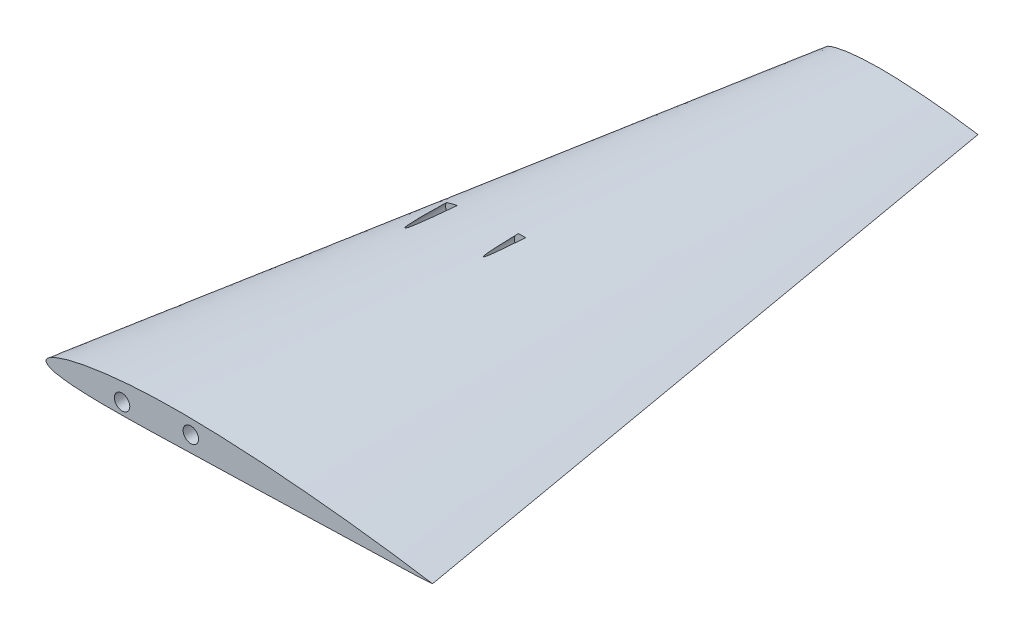
ISO-10303-21;
HEADER;
FILE_DESCRIPTION(('STEP AP214'),'2;1');
FILE_NAME('part.step','',(''),(''),'','','');
FILE_SCHEMA(('AUTOMOTIVE_DESIGN { 1 0 10303 214 1 1 1 1 }'));
ENDSEC;
DATA;
#1=APPLICATION_CONTEXT('core data for automotive mechanical design processes');
#2=APPLICATION_PROTOCOL_DEFINITION('international standard','automotive_design',2000,#1);
#3=PRODUCT_CONTEXT('',#1,'mechanical');
#4=PRODUCT('Part','Part','',(#3));
#5=PRODUCT_RELATED_PRODUCT_CATEGORY('part','',(#4));
#6=PRODUCT_DEFINITION_FORMATION('','',#4);
#7=PRODUCT_DEFINITION_CONTEXT('part definition',#1,'design');
#8=PRODUCT_DEFINITION('design','',#6,#7);
#9=PRODUCT_DEFINITION_SHAPE('','',#8);
#10=(LENGTH_UNIT() NAMED_UNIT(*) SI_UNIT(.MILLI.,.METRE.));
#11=(NAMED_UNIT(*) PLANE_ANGLE_UNIT() SI_UNIT($,.RADIAN.));
#12=(NAMED_UNIT(*) SI_UNIT($,.STERADIAN.) SOLID_ANGLE_UNIT());
#13=UNCERTAINTY_MEASURE_WITH_UNIT(LENGTH_MEASURE(1.E-05),#10,'distance_accuracy_value','');
#14=(GEOMETRIC_REPRESENTATION_CONTEXT(3) GLOBAL_UNCERTAINTY_ASSIGNED_CONTEXT((#13)) GLOBAL_UNIT_ASSIGNED_CONTEXT((#10,
#11,#12)) REPRESENTATION_CONTEXT('',''));
#15=CARTESIAN_POINT('',(0.,0.,0.));
#16=DIRECTION('',(0.,0.,1.));
#17=DIRECTION('',(1.,0.,0.));
#18=AXIS2_PLACEMENT_3D('',#15,#16,#17);
#19=CARTESIAN_POINT('',(55.4064649526419,0.683348343401608,-304.8));
#20=DIRECTION('',(0.,0.,-1.));
#21=DIRECTION('',(-1.,0.,0.));
#22=AXIS2_PLACEMENT_3D('',#19,#20,#21);
#23=PLANE('',#22);
#24=CARTESIAN_POINT('',(123.952,-0.210449087184836,-304.8));
#25=CARTESIAN_POINT('',(122.790706343836,-0.0342273031484342,-304.8));
#26=CARTESIAN_POINT('',(120.467124093883,0.318367242829571,-304.8));
#27=CARTESIAN_POINT('',(115.810899397513,0.963076186824327,-304.8));
#28=CARTESIAN_POINT('',(109.978584953169,1.67935282167523,-304.8));
#29=CARTESIAN_POINT('',(102.9662396439,2.40089084984383,-304.8));
#30=CARTESIAN_POINT('',(95.9424731318779,2.98052031405359,-304.8));
#31=CARTESIAN_POINT('',(88.9093311385905,3.39949018685831,-304.8));
#32=CARTESIAN_POINT('',(81.8568042084218,3.65623455701682,-304.8));
#33=CARTESIAN_POINT('',(75.9658797393383,3.64454226280271,-304.8));
#34=CARTESIAN_POINT('',(71.2477816960848,3.43544167153705,-304.8));
#35=CARTESIAN_POINT('',(67.7128965410631,3.16843628604555,-304.8));
#36=CARTESIAN_POINT('',(64.1847212290625,2.77303923837818,-304.8));
#37=CARTESIAN_POINT('',(61.2581084835049,2.30694331405794,-304.8));
#38=CARTESIAN_POINT('',(58.9281697884809,1.81032736893172,-304.8));
#39=CARTESIAN_POINT('',(57.1852042237573,1.37998192647884,-304.8));
#40=CARTESIAN_POINT('',(55.7320959132784,0.809837774369731,-304.8));
#41=CARTESIAN_POINT('',(54.5654760035073,0.355946309114248,-304.8));
#42=CARTESIAN_POINT('',(53.3853953115185,-0.710813052215074,-304.8));
#43=CARTESIAN_POINT('',(54.761560506712,-1.49399969401676,-304.8));
#44=CARTESIAN_POINT('',(55.9743801762301,-1.75786460812164,-304.8));
#45=CARTESIAN_POINT('',(57.5042732088365,-1.98721640481284,-304.8));
#46=CARTESIAN_POINT('',(59.2669922488575,-2.11779793837691,-304.8));
#47=CARTESIAN_POINT('',(61.6125691962496,-2.21911791515392,-304.8));
#48=CARTESIAN_POINT('',(64.5246649381679,-2.2520217936348,-304.8));
#49=CARTESIAN_POINT('',(68.0110664044848,-2.21402525142196,-304.8));
#50=CARTESIAN_POINT('',(71.4871936874957,-2.13488754961327,-304.8));
#51=CARTESIAN_POINT('',(76.1153973510382,-1.99846459470955,-304.8));
#52=CARTESIAN_POINT('',(81.9127572556462,-1.81547105963111,-304.8));
#53=CARTESIAN_POINT('',(88.8828697086837,-1.58169653441289,-304.8));
#54=CARTESIAN_POINT('',(95.8723985528679,-1.310632769524,-304.8));
#55=CARTESIAN_POINT('',(102.872094777363,-1.04510946434211,-304.8));
#56=CARTESIAN_POINT('',(109.884310300863,-0.79007690257827,-304.8));
#57=CARTESIAN_POINT('',(115.736638740901,-0.593669620344815,-304.8));
#58=CARTESIAN_POINT('',(119.251823206111,-0.479271837733113,-304.8));
#59=CARTESIAN_POINT('',(120.424928472982,-0.44109442695188,-304.8));
#60=B_SPLINE_CURVE_WITH_KNOTS('',3,(#24,#25,#26,#27,#28,#29,#30,#31,#32,#33,#34,#35,#36,#37,#38,
#39,#40,#41,#42,#43,#44,#45,#46,#47,#48,#49,#50,#51,#52,#53,#54,#55,#56,#57,#58,#59),
.UNSPECIFIED.,.F.,.F.,(4,1,1,1,1,1,1,1,1,1,1,1,1,1,1,1,1,1,1,1,1,1,1,1,1,1,1,1,1,1,1,1,1,4),(0.,
0.0255158473215281,0.0510535553295715,0.102111638343893,0.153156698624328,0.2041805489657,
0.255198388322243,0.306198821045907,0.357469283972498,0.383114062596156,0.408777820460856,
0.434465463977822,0.460211086520082,0.473144435406998,0.486143688963209,0.499400538642225,
0.506172720054022,0.515220450047496,0.524256147452752,0.531058294108782,0.544124425529066,
0.55697037053682,0.569702534234132,0.595038372382182,0.620262585931604,0.645429077809132,
0.67057348925881,0.720845485800824,0.771430884013805,0.822072719977054,0.872795897802648,
0.923597705730035,0.974502637145741,1.),.UNSPECIFIED.);
#61=CARTESIAN_POINT('',(123.952,-0.210449087184837,-304.8));
#62=VERTEX_POINT('',#61);
#63=CARTESIAN_POINT('',(120.424928472982,-0.44109442695188,-304.8));
#64=VERTEX_POINT('',#63);
#65=EDGE_CURVE('E176',#62,#64,#60,.T.);
#66=ORIENTED_EDGE('',*,*,#65,.F.);
#67=DIRECTION('',(0.997868719044229,0.0652535022280712,0.));
#68=VECTOR('',#67,1.);
#69=CARTESIAN_POINT('',(120.424928472982,-0.44109442695188,-304.8));
#70=LINE('',#69,#68);
#71=EDGE_CURVE('E112',#64,#62,#70,.T.);
#72=ORIENTED_EDGE('',*,*,#71,.F.);
#73=EDGE_LOOP('',(#66,#72));
#74=FACE_BOUND('',#73,.T.);
#75=ADVANCED_FACE('F61',(#74),#23,.T.);
#76=CARTESIAN_POINT('',(3.96627708992465,3.38381364018916,0.));
#77=DIRECTION('',(0.,0.,-1.));
#78=DIRECTION('',(-1.,0.,0.));
#79=AXIS2_PLACEMENT_3D('',#76,#77,#78);
#80=PLANE('',#79);
#81=CARTESIAN_POINT('',(34.9854091677935,1.15640258388081,0.));
#82=DIRECTION('',(0.,0.,1.));
#83=DIRECTION('',(1.,0.,0.));
#84=AXIS2_PLACEMENT_3D('',#81,#82,#83);
#85=CIRCLE('',#84,3.556);
#86=CARTESIAN_POINT('',(38.5414091677935,1.15640258388081,0.));
#87=VERTEX_POINT('',#86);
#88=EDGE_CURVE('E308',#87,#87,#85,.T.);
#89=ORIENTED_EDGE('',*,*,#88,.F.);
#90=EDGE_LOOP('',(#89));
#91=FACE_BOUND('',#90,.T.);
#92=CARTESIAN_POINT('',(66.6145908322064,3.92359741611921,0.));
#93=DIRECTION('',(0.,0.,1.));
#94=DIRECTION('',(1.,0.,0.));
#95=AXIS2_PLACEMENT_3D('',#92,#93,#94);
#96=CIRCLE('',#95,3.556);
#97=CARTESIAN_POINT('',(70.1705908322064,3.92359741611921,0.));
#98=VERTEX_POINT('',#97);
#99=EDGE_CURVE('E118',#98,#98,#96,.T.);
#100=ORIENTED_EDGE('',*,*,#99,.F.);
#101=EDGE_LOOP('',(#100));
#102=FACE_BOUND('',#101,.T.);
#103=CARTESIAN_POINT('',(177.8,0.149352,0.));
#104=CARTESIAN_POINT('',(174.857195049521,0.612681625122355,0.));
#105=CARTESIAN_POINT('',(168.969063902231,1.53973783273871,0.));
#106=CARTESIAN_POINT('',(157.168969239347,3.2405873734949,0.));
#107=CARTESIAN_POINT('',(142.387066218281,5.13954993005009,0.));
#108=CARTESIAN_POINT('',(124.612423323689,7.06851398771198,0.));
#109=CARTESIAN_POINT('',(106.806810582949,8.63772837976143,0.));
#110=CARTESIAN_POINT('',(88.975151697433,9.79960755707183,0.));
#111=CARTESIAN_POINT('',(71.0920384127062,10.5503213239505,0.));
#112=CARTESIAN_POINT('',(56.1512115576386,10.6038241747413,0.));
#113=CARTESIAN_POINT('',(44.1821401860872,10.1401010113974,0.));
#114=CARTESIAN_POINT('',(35.2131358681503,9.5128163495268,0.));
#115=CARTESIAN_POINT('',(26.2593367738904,8.55980787572253,0.));
#116=CARTESIAN_POINT('',(18.8302327928316,7.41899998659591,0.));
#117=CARTESIAN_POINT('',(12.913992758507,6.19236397962518,0.));
#118=CARTESIAN_POINT('',(8.48737934114215,5.12551854924347,0.));
#119=CARTESIAN_POINT('',(4.79393335490391,3.7000216159676,0.));
#120=CARTESIAN_POINT('',(1.82872511104503,2.56532259711233,0.));
#121=CARTESIAN_POINT('',(-1.17927391697623,-0.123552282536533,0.));
#122=CARTESIAN_POINT('',(2.29992385423439,-2.12930955161099,0.));
#123=CARTESIAN_POINT('',(5.37217276551407,-2.81564850638312,0.));
#124=CARTESIAN_POINT('',(9.24907566939319,-3.41893055998174,0.));
#125=CARTESIAN_POINT('',(13.7178700663076,-3.77499641129469,0.));
#126=CARTESIAN_POINT('',(19.665331559494,-4.06507630656292,0.));
#127=CARTESIAN_POINT('',(27.0505733264275,-4.18963519348183,0.));
#128=CARTESIAN_POINT('',(35.8933797787478,-4.14248221306535,0.));
#129=CARTESIAN_POINT('',(44.7107094282913,-3.99084129943251,0.));
#130=CARTESIAN_POINT('',(56.4507632339333,-3.71017542029488,0.));
#131=CARTESIAN_POINT('',(71.1567081757834,-3.32790041098022,0.));
#132=CARTESIAN_POINT('',(88.8377247038045,-2.83338852479331,0.));
#133=CARTESIAN_POINT('',(106.568511789586,-2.24457712549779,0.));
#134=CARTESIAN_POINT('',(124.32500734663,-1.66996105742068,0.));
#135=CARTESIAN_POINT('',(142.113106471878,-1.12212851342749,0.));
#136=CARTESIAN_POINT('',(156.958652888787,-0.706609275659402,0.));
#137=CARTESIAN_POINT('',(165.875537757121,-0.466092487718349,0.));
#138=CARTESIAN_POINT('',(168.851326,-0.385826,0.));
#139=B_SPLINE_CURVE_WITH_KNOTS('',3,(#103,#104,#105,#106,#107,#108,#109,#110,#111,#112,#113,
#114,#115,#116,#117,#118,#119,#120,#121,#122,#123,#124,#125,#126,#127,#128,#129,#130,#131,#132,
#133,#134,#135,#136,#137,#138),.UNSPECIFIED.,.F.,.F.,(4,1,1,1,1,1,1,1,1,1,1,1,1,1,1,1,1,1,1,1,1,
1,1,1,1,1,1,1,1,1,1,1,1,4),(0.,0.0255158473215281,0.0510535553295715,0.102111638343893,
0.153156698624328,0.2041805489657,0.255198388322243,0.306198821045907,0.357469283972498,
0.383114062596156,0.408777820460856,0.434465463977822,0.460211086520082,0.473144435406998,
0.486143688963209,0.499400538642225,0.506172720054022,0.515220450047496,0.524256147452752,
0.531058294108782,0.544124425529066,0.55697037053682,0.569702534234132,0.595038372382182,
0.620262585931604,0.645429077809132,0.67057348925881,0.720845485800824,0.771430884013805,
0.822072719977054,0.872795897802648,0.923597705730035,0.974502637145741,1.),.UNSPECIFIED.);
#140=CARTESIAN_POINT('',(177.8,0.149352,0.));
#141=VERTEX_POINT('',#140);
#142=CARTESIAN_POINT('',(168.851326,-0.385826,0.));
#143=VERTEX_POINT('',#142);
#144=EDGE_CURVE('E218',#141,#143,#139,.T.);
#145=ORIENTED_EDGE('',*,*,#144,.T.);
#146=DIRECTION('',(0.998216446900987,0.0596986192166096,0.));
#147=VECTOR('',#146,1.);
#148=CARTESIAN_POINT('',(168.851326,-0.385826,0.));
#149=LINE('',#148,#147);
#150=EDGE_CURVE('E206',#143,#141,#149,.T.);
#151=ORIENTED_EDGE('',*,*,#150,.T.);
#152=EDGE_LOOP('',(#145,#151));
#153=FACE_BOUND('',#152,.T.);
#154=ADVANCED_FACE('F153',(#91,#102,#153),#80,.F.);
#155=CARTESIAN_POINT('',(168.851326,-0.385826,0.));
#156=CARTESIAN_POINT('',(120.424928472982,-0.44109442695188,-304.8));
#157=CARTESIAN_POINT('',(165.875537757121,-0.466092487718349,0.));
#158=CARTESIAN_POINT('',(119.251823206111,-0.479271837733113,-304.8));
#159=CARTESIAN_POINT('',(156.958652888787,-0.706609275659402,0.));
#160=CARTESIAN_POINT('',(115.736638740901,-0.593669620344815,-304.8));
#161=CARTESIAN_POINT('',(142.113106471878,-1.12212851342749,0.));
#162=CARTESIAN_POINT('',(109.884310300863,-0.79007690257827,-304.8));
#163=CARTESIAN_POINT('',(124.32500734663,-1.66996105742068,0.));
#164=CARTESIAN_POINT('',(102.872094777363,-1.04510946434211,-304.8));
#165=CARTESIAN_POINT('',(106.568511789586,-2.24457712549779,0.));
#166=CARTESIAN_POINT('',(95.8723985528679,-1.310632769524,-304.8));
#167=CARTESIAN_POINT('',(88.8377247038045,-2.83338852479331,0.));
#168=CARTESIAN_POINT('',(88.8828697086837,-1.58169653441289,-304.8));
#169=CARTESIAN_POINT('',(71.1567081757834,-3.32790041098022,0.));
#170=CARTESIAN_POINT('',(81.9127572556462,-1.81547105963111,-304.8));
#171=CARTESIAN_POINT('',(56.4507632339333,-3.71017542029488,0.));
#172=CARTESIAN_POINT('',(76.1153973510382,-1.99846459470955,-304.8));
#173=CARTESIAN_POINT('',(44.7107094282913,-3.99084129943251,0.));
#174=CARTESIAN_POINT('',(71.4871936874957,-2.13488754961327,-304.8));
#175=CARTESIAN_POINT('',(35.8933797787478,-4.14248221306535,0.));
#176=CARTESIAN_POINT('',(68.0110664044848,-2.21402525142196,-304.8));
#177=CARTESIAN_POINT('',(27.0505733264275,-4.18963519348183,0.));
#178=CARTESIAN_POINT('',(64.5246649381679,-2.2520217936348,-304.8));
#179=CARTESIAN_POINT('',(19.665331559494,-4.06507630656292,0.));
#180=CARTESIAN_POINT('',(61.6125691962496,-2.21911791515392,-304.8));
#181=CARTESIAN_POINT('',(13.7178700663076,-3.77499641129469,0.));
#182=CARTESIAN_POINT('',(59.2669922488575,-2.11779793837691,-304.8));
#183=CARTESIAN_POINT('',(9.24907566939319,-3.41893055998174,0.));
#184=CARTESIAN_POINT('',(57.5042732088365,-1.98721640481284,-304.8));
#185=CARTESIAN_POINT('',(5.37217276551407,-2.81564850638312,0.));
#186=CARTESIAN_POINT('',(55.9743801762301,-1.75786460812164,-304.8));
#187=CARTESIAN_POINT('',(2.29992385423439,-2.12930955161099,0.));
#188=CARTESIAN_POINT('',(54.761560506712,-1.49399969401676,-304.8));
#189=CARTESIAN_POINT('',(-1.17927391697623,-0.123552282536533,0.));
#190=CARTESIAN_POINT('',(53.3853953115185,-0.710813052215074,-304.8));
#191=CARTESIAN_POINT('',(1.82872511104503,2.56532259711233,0.));
#192=CARTESIAN_POINT('',(54.5654760035073,0.355946309114248,-304.8));
#193=CARTESIAN_POINT('',(4.79393335490391,3.7000216159676,0.));
#194=CARTESIAN_POINT('',(55.7320959132784,0.809837774369731,-304.8));
#195=CARTESIAN_POINT('',(8.48737934114215,5.12551854924347,0.));
#196=CARTESIAN_POINT('',(57.1852042237573,1.37998192647884,-304.8));
#197=CARTESIAN_POINT('',(12.913992758507,6.19236397962518,0.));
#198=CARTESIAN_POINT('',(58.9281697884809,1.81032736893172,-304.8));
#199=CARTESIAN_POINT('',(18.8302327928316,7.41899998659591,0.));
#200=CARTESIAN_POINT('',(61.2581084835049,2.30694331405794,-304.8));
#201=CARTESIAN_POINT('',(26.2593367738904,8.55980787572253,0.));
#202=CARTESIAN_POINT('',(64.1847212290625,2.77303923837818,-304.8));
#203=CARTESIAN_POINT('',(35.2131358681503,9.5128163495268,0.));
#204=CARTESIAN_POINT('',(67.7128965410631,3.16843628604555,-304.8));
#205=CARTESIAN_POINT('',(44.1821401860872,10.1401010113974,0.));
#206=CARTESIAN_POINT('',(71.2477816960848,3.43544167153705,-304.8));
#207=CARTESIAN_POINT('',(56.1512115576386,10.6038241747413,0.));
#208=CARTESIAN_POINT('',(75.9658797393383,3.64454226280271,-304.8));
#209=CARTESIAN_POINT('',(71.0920384127062,10.5503213239505,0.));
#210=CARTESIAN_POINT('',(81.8568042084218,3.65623455701682,-304.8));
#211=CARTESIAN_POINT('',(88.975151697433,9.79960755707183,0.));
#212=CARTESIAN_POINT('',(88.9093311385905,3.39949018685831,-304.8));
#213=CARTESIAN_POINT('',(106.806810582949,8.63772837976143,0.));
#214=CARTESIAN_POINT('',(95.9424731318779,2.98052031405359,-304.8));
#215=CARTESIAN_POINT('',(124.612423323689,7.06851398771198,0.));
#216=CARTESIAN_POINT('',(102.9662396439,2.40089084984383,-304.8));
#217=CARTESIAN_POINT('',(142.387066218281,5.13954993005009,0.));
#218=CARTESIAN_POINT('',(109.978584953169,1.67935282167523,-304.8));
#219=CARTESIAN_POINT('',(157.168969239347,3.2405873734949,0.));
#220=CARTESIAN_POINT('',(115.810899397513,0.963076186824327,-304.8));
#221=CARTESIAN_POINT('',(168.969063902231,1.53973783273871,0.));
#222=CARTESIAN_POINT('',(120.467124093883,0.318367242829571,-304.8));
#223=CARTESIAN_POINT('',(174.857195049521,0.612681625122355,0.));
#224=CARTESIAN_POINT('',(122.790706343836,-0.0342273031484342,-304.8));
#225=CARTESIAN_POINT('',(177.8,0.149352,0.));
#226=CARTESIAN_POINT('',(123.952,-0.210449087184836,-304.8));
#227=B_SPLINE_SURFACE_WITH_KNOTS('',3,1,((#155,#156),(#157,#158),(#159,#160),(#161,#162),(#163,
#164),(#165,#166),(#167,#168),(#169,#170),(#171,#172),(#173,#174),(#175,#176),(#177,#178),(#179,
#180),(#181,#182),(#183,#184),(#185,#186),(#187,#188),(#189,#190),(#191,#192),(#193,#194),(#195,
#196),(#197,#198),(#199,#200),(#201,#202),(#203,#204),(#205,#206),(#207,#208),(#209,#210),(#211,
#212),(#213,#214),(#215,#216),(#217,#218),(#219,#220),(#221,#222),(#223,#224),(#225,#226)),
.UNSPECIFIED.,.F.,.F.,.F.,(4,1,1,1,1,1,1,1,1,1,1,1,1,1,1,1,1,1,1,1,1,1,1,1,1,1,1,1,1,1,1,1,1,4),
(2,2),(0.,0.0254973628542589,0.0764022942699649,0.127204102197352,0.177927280022946,
0.228569115986195,0.279154514199176,0.32942651074119,0.354570922190868,0.379737414068396,
0.404961627617818,0.430297465765868,0.44302962946318,0.455875574470934,0.468941705891218,
0.475743852547248,0.484779549952504,0.493827279945978,0.500599461357775,0.513856311036792,
0.526855564593002,0.539788913479918,0.565534536022178,0.591222179539144,0.616885937403844,
0.642530716027502,0.693801178954093,0.744801611677757,0.7958194510343,0.846843301375672,
0.897888361656107,0.948946444670429,0.974484152678472,1.),(0.,1.),.UNSPECIFIED.);
#228=CARTESIAN_POINT('',(31.8586199098439,2.8500155669353,-152.4));
#229=CARTESIAN_POINT('',(31.8692752259216,2.8696880703349,-152.168223667147));
#230=CARTESIAN_POINT('',(31.8801531715164,2.88932748684379,-151.93645475913));
#231=CARTESIAN_POINT('',(31.9023683769663,2.92854927431573,-151.472562724776));
#232=CARTESIAN_POINT('',(31.9137063385597,2.94813150522707,-151.240439620204));
#233=CARTESIAN_POINT('',(31.9368355774724,2.98720876231975,-150.775928889343));
#234=CARTESIAN_POINT('',(31.948627379815,3.00670365648413,-150.54354127809));
#235=CARTESIAN_POINT('',(31.9726549302891,3.0455744523019,-150.078590926734));
#236=CARTESIAN_POINT('',(31.9848910267937,3.06495024601484,-149.846028195611));
#237=CARTESIAN_POINT('',(32.0097945531266,3.10354957858182,-149.380816710537));
#238=CARTESIAN_POINT('',(32.0224621581082,3.12277305160919,-149.1481679605));
#239=CARTESIAN_POINT('',(32.0486176706619,3.16163507632771,-148.675563526288));
#240=CARTESIAN_POINT('',(32.0621188469789,3.18126767537144,-148.43560808686));
#241=CARTESIAN_POINT('',(32.0895398381856,3.22029341112269,-147.955795157231));
#242=CARTESIAN_POINT('',(32.1034594895352,3.2396866373029,-147.715937664959));
#243=CARTESIAN_POINT('',(32.1316983436154,3.27820385666297,-147.236416582552));
#244=CARTESIAN_POINT('',(32.1460172209117,3.29732805105679,-146.996752989416));
#245=CARTESIAN_POINT('',(32.1750642919432,3.33531714092556,-146.517720537446));
#246=CARTESIAN_POINT('',(32.1897919738182,3.35418232004987,-146.278351670086));
#247=CARTESIAN_POINT('',(32.2196656731974,3.39165919917818,-145.800009183034));
#248=CARTESIAN_POINT('',(32.2348109795609,3.41027125815331,-145.561035547013));
#249=CARTESIAN_POINT('',(32.2758981379558,3.45972752777088,-144.922487660133));
#250=CARTESIAN_POINT('',(32.3022547551008,3.49038531780453,-144.522925542686));
#251=CARTESIAN_POINT('',(32.356358770572,3.55116429845527,-143.724294105544));
#252=CARTESIAN_POINT('',(32.3841046235307,3.5812860369254,-143.325224722926));
#253=CARTESIAN_POINT('',(32.4412220288348,3.64114837763724,-142.526738622929));
#254=CARTESIAN_POINT('',(32.4705953014793,3.67088853399921,-142.12732199489));
#255=CARTESIAN_POINT('',(32.5312819386604,3.7301548763206,-141.327308267675));
#256=CARTESIAN_POINT('',(32.5626012934745,3.75968005385524,-140.926711546953));
#257=CARTESIAN_POINT('',(32.6276074301367,3.8187035065816,-140.123514179539));
#258=CARTESIAN_POINT('',(32.6613061034654,3.84820077202463,-139.720914416725));
#259=CARTESIAN_POINT('',(32.7316700132123,3.9073890466425,-138.912903024563));
#260=CARTESIAN_POINT('',(32.7683557581972,3.93707983389013,-138.507493157333));
#261=CARTESIAN_POINT('',(32.8439067215349,3.99564855559111,-137.710534936268));
#262=CARTESIAN_POINT('',(32.8826583487013,4.02452054991055,-137.318975500614));
#263=CARTESIAN_POINT('',(32.944008574676,4.068179836793,-136.731699649931));
#264=CARTESIAN_POINT('',(32.9650127858569,4.0828026067953,-136.535804342649));
#265=CARTESIAN_POINT('',(33.0082753137247,4.11220419063372,-136.144174694005));
#266=CARTESIAN_POINT('',(33.0305335593632,4.12698299559109,-135.948440344161));
#267=CARTESIAN_POINT('',(33.076448126193,4.15669399740233,-135.557959870798));
#268=CARTESIAN_POINT('',(33.1000983806166,4.17162532377333,-135.363212970549));
#269=CARTESIAN_POINT('',(33.1492006944386,4.20177704178306,-134.973925960101));
#270=CARTESIAN_POINT('',(33.1746531306358,4.2169974933822,-134.779385901829));
#271=CARTESIAN_POINT('',(33.227566194733,4.24768910713269,-134.392404121671));
#272=CARTESIAN_POINT('',(33.2550065230158,4.26315674504827,-134.199959366757));
#273=CARTESIAN_POINT('',(33.3126781613681,4.2945843993193,-133.815672547765));
#274=CARTESIAN_POINT('',(33.3429073975111,4.31054404401397,-133.623830143802));
#275=CARTESIAN_POINT('',(33.4065945682477,4.34289711980822,-133.243651241052));
#276=CARTESIAN_POINT('',(33.4399979640377,4.35928060590615,-133.055304946106));
#277=CARTESIAN_POINT('',(33.4939897563615,4.38459025679439,-132.773320067792));
#278=CARTESIAN_POINT('',(33.5126635591804,4.39316167407191,-132.679283489689));
#279=CARTESIAN_POINT('',(33.5516091779179,4.41060156494713,-132.491590276682));
#280=CARTESIAN_POINT('',(33.5718806074922,4.41946996643047,-132.397933555645));
#281=CARTESIAN_POINT('',(33.61428324798,4.43751150334164,-132.211933372317));
#282=CARTESIAN_POINT('',(33.6363967533245,4.44668131817576,-132.119585572285));
#283=CARTESIAN_POINT('',(33.683319823893,4.46553317758879,-131.935522548842));
#284=CARTESIAN_POINT('',(33.7081318663825,4.4752156885691,-131.843807990285));
#285=CARTESIAN_POINT('',(33.748187256442,4.49026181404171,-131.707342648349));
#286=CARTESIAN_POINT('',(33.7619787013614,4.49535254869513,-131.662136289227));
#287=CARTESIAN_POINT('',(33.7907613076418,4.50575892250243,-131.572135068105));
#288=CARTESIAN_POINT('',(33.8057523281613,4.51107453521905,-131.527340158483));
#289=CARTESIAN_POINT('',(33.8372518865128,4.52198549518625,-131.43839379073));
#290=CARTESIAN_POINT('',(33.8537581682725,4.52758042107814,-131.394241485841));
#291=CARTESIAN_POINT('',(33.8888246367728,4.53915030451152,-131.306816377221));
#292=CARTESIAN_POINT('',(33.9073836269791,4.54512503980532,-131.263543078345));
#293=CARTESIAN_POINT('',(33.93156595733,4.55266064637334,-131.212220852903));
#294=CARTESIAN_POINT('',(33.9357706962539,4.55396273537836,-131.203463052201));
#295=CARTESIAN_POINT('',(33.9443215452491,4.55659267783519,-131.186019268719));
#296=CARTESIAN_POINT('',(33.9486676730772,4.55792053451461,-131.177333295133));
#297=CARTESIAN_POINT('',(33.9619374526124,4.56194618995085,-131.151395455758));
#298=CARTESIAN_POINT('',(33.9710912211057,4.56468567436394,-131.134266409083));
#299=CARTESIAN_POINT('',(33.9901116393772,4.57028847713518,-131.100502476481));
#300=CARTESIAN_POINT('',(33.9999758493774,4.57315135928641,-131.083866152484));
#301=CARTESIAN_POINT('',(34.0206184513274,4.57903756826168,-131.051200730743));
#302=CARTESIAN_POINT('',(34.0313965175687,4.58206083777932,-131.035171419577));
#303=CARTESIAN_POINT('',(34.0535776305492,4.58815900276904,-131.004726726081));
#304=CARTESIAN_POINT('',(34.064927045379,4.59122470129731,-130.990270869717));
#305=CARTESIAN_POINT('',(34.0889948718585,4.59758449542278,-130.962533733036));
#306=CARTESIAN_POINT('',(34.101714944311,4.60087886633977,-130.949253914001));
#307=CARTESIAN_POINT('',(34.126057109443,4.60702181779911,-130.927185871253));
#308=CARTESIAN_POINT('',(34.1373597297205,4.60982113931612,-130.918037329253));
#309=CARTESIAN_POINT('',(34.1612061554066,4.61558959705492,-130.901597086554));
#310=CARTESIAN_POINT('',(34.1737460568198,4.61855818741261,-130.894299789397));
#311=CARTESIAN_POINT('',(34.1958691000345,4.62365611532159,-130.88433392749));
#312=CARTESIAN_POINT('',(34.2051247886509,4.62575221941281,-130.880931356813));
#313=CARTESIAN_POINT('',(34.2240724529988,4.62995928530174,-130.875723403299));
#314=CARTESIAN_POINT('',(34.2337638296414,4.63207022352202,-130.873915893762));
#315=CARTESIAN_POINT('',(34.2533832335537,4.63625530984518,-130.872111469301));
#316=CARTESIAN_POINT('',(34.2633122613987,4.63832919534025,-130.872124457479));
#317=CARTESIAN_POINT('',(34.2830217973706,4.6423586167766,-130.873989049682));
#318=CARTESIAN_POINT('',(34.292802186186,4.64431406105336,-130.875842058929));
#319=CARTESIAN_POINT('',(34.3137068546679,4.6484056801054,-130.881659965952));
#320=CARTESIAN_POINT('',(34.3247446854402,4.65050828504427,-130.885952353661));
#321=CARTESIAN_POINT('',(34.3460351653283,4.65446707112821,-130.896283046032));
#322=CARTESIAN_POINT('',(34.356284975996,4.65632237763215,-130.902327319418));
#323=CARTESIAN_POINT('',(34.3744720929575,4.65953886162144,-130.914656485065));
#324=CARTESIAN_POINT('',(34.3825248325187,4.66093234560307,-130.920767099286));
#325=CARTESIAN_POINT('',(34.3980746623256,4.66357183962417,-130.933658780568));
#326=CARTESIAN_POINT('',(34.4055725187635,4.66481805449115,-130.940438891772));
#327=CARTESIAN_POINT('',(34.427389415424,4.668377586063,-130.96158830116));
#328=CARTESIAN_POINT('',(34.4409840283684,4.67050346520712,-130.976731749032));
#329=CARTESIAN_POINT('',(34.473785107919,4.67546293668361,-131.016904234589));
#330=CARTESIAN_POINT('',(34.491957528137,4.67804126243523,-131.042783508697));
#331=CARTESIAN_POINT('',(34.5259620365365,4.68263790511147,-131.096108201398));
#332=CARTESIAN_POINT('',(34.5417887962293,4.68465495586809,-131.123556995284));
#333=CARTESIAN_POINT('',(34.5718227626817,4.68830180700601,-131.179545396055));
#334=CARTESIAN_POINT('',(34.5860201079799,4.68992930814043,-131.208090378665));
#335=CARTESIAN_POINT('',(34.6131024587082,4.69288502813279,-131.265760941948));
#336=CARTESIAN_POINT('',(34.6259890178049,4.69421360362479,-131.294885785153));
#337=CARTESIAN_POINT('',(34.6572457080588,4.69727905030849,-131.368934476395));
#338=CARTESIAN_POINT('',(34.6749526549656,4.6988652898958,-131.414143257345));
#339=CARTESIAN_POINT('',(34.7086747982844,4.70165818955472,-131.505203074835));
#340=CARTESIAN_POINT('',(34.7246894829198,4.70286473501564,-131.551054300943));
#341=CARTESIAN_POINT('',(34.7708656133318,4.70606035539205,-131.689442208435));
#342=CARTESIAN_POINT('',(34.7990878170014,4.70761891537594,-131.782633496791));
#343=CARTESIAN_POINT('',(34.8522084930625,4.71000501523823,-131.970044210077));
#344=CARTESIAN_POINT('',(34.8771034418283,4.71083178526445,-132.064264612445));
#345=CARTESIAN_POINT('',(34.9244586314536,4.711959058833,-132.253288012051));
#346=CARTESIAN_POINT('',(34.9469195300703,4.71225970488498,-132.348090844545));
#347=CARTESIAN_POINT('',(34.9899673682049,4.71246451910321,-132.537978112098));
#348=CARTESIAN_POINT('',(35.0105568793356,4.71236924002205,-132.633061969485));
#349=CARTESIAN_POINT('',(35.0502634054921,4.71186642027366,-132.823481173189));
#350=CARTESIAN_POINT('',(35.0693812010158,4.71145904639337,-132.918816358084));
#351=CARTESIAN_POINT('',(35.1154585374132,4.71013097279935,-133.156255718485));
#352=CARTESIAN_POINT('',(35.1416965296512,4.7090568316293,-133.298498771487));
#353=CARTESIAN_POINT('',(35.1921353991123,4.70647775029871,-133.583343188623));
#354=CARTESIAN_POINT('',(35.216336203657,4.70497279477691,-133.725944565355));
#355=CARTESIAN_POINT('',(35.2865081646859,4.69994478213864,-134.154174218181));
#356=CARTESIAN_POINT('',(35.3300427481029,4.69590880692129,-134.440195340989));
#357=CARTESIAN_POINT('',(35.4126370184039,4.68688744291532,-135.013142327073));
#358=CARTESIAN_POINT('',(35.4516922561942,4.68190112305959,-135.300068803945));
#359=CARTESIAN_POINT('',(35.5263842633843,4.67121475878687,-135.8743307096));
#360=CARTESIAN_POINT('',(35.5620212689307,4.66551476373653,-136.161666108739));
#361=CARTESIAN_POINT('',(35.6305642126123,4.65356109880116,-136.736252163523));
#362=CARTESIAN_POINT('',(35.6634737991355,4.64730819246752,-137.023502402951));
#363=CARTESIAN_POINT('',(35.7271076128537,4.63434313565485,-137.598238152924));
#364=CARTESIAN_POINT('',(35.7578318032739,4.62763097745145,-137.885723667346));
#365=CARTESIAN_POINT('',(35.8472588833305,4.60692627478495,-138.748188697031));
#366=CARTESIAN_POINT('',(35.9032464820545,4.59235995936211,-139.32343607513));
#367=CARTESIAN_POINT('',(36.0031103764018,4.56400344727566,-140.401281901696));
#368=CARTESIAN_POINT('',(36.0476217112061,4.55034972380688,-140.903826081921));
#369=CARTESIAN_POINT('',(36.1333497583224,4.52231987488015,-141.909177779971));
#370=CARTESIAN_POINT('',(36.1745664489649,4.50794374467182,-142.411985299506));
#371=CARTESIAN_POINT('',(36.2941719201543,4.4638989114963,-143.920857871797));
#372=CARTESIAN_POINT('',(36.3685021170835,4.43331792437385,-144.927217737185));
#373=CARTESIAN_POINT('',(36.5092542648998,4.37026956850627,-146.940453021775));
#374=CARTESIAN_POINT('',(36.5756759704688,4.33780214129097,-147.947328455999));
#375=CARTESIAN_POINT('',(36.702309895431,4.27128660700302,-149.961372684713));
#376=CARTESIAN_POINT('',(36.7625223830489,4.23723856830156,-150.968541464645));
#377=CARTESIAN_POINT('',(36.828295570236,4.19761835303054,-152.11721701672));
#378=CARTESIAN_POINT('',(36.8363415040388,4.19272788308686,-152.258607407554));
#379=CARTESIAN_POINT('',(36.8443390593209,4.18782397629494,-152.4));
#380=B_SPLINE_CURVE_WITH_KNOTS('',3,(#228,#229,#230,#231,#232,#233,#234,#235,#236,#237,#238,
#239,#240,#241,#242,#243,#244,#245,#246,#247,#248,#249,#250,#251,#252,#253,#254,#255,#256,#257,
#258,#259,#260,#261,#262,#263,#264,#265,#266,#267,#268,#269,#270,#271,#272,#273,#274,#275,#276,
#277,#278,#279,#280,#281,#282,#283,#284,#285,#286,#287,#288,#289,#290,#291,#292,#293,#294,#295,
#296,#297,#298,#299,#300,#301,#302,#303,#304,#305,#306,#307,#308,#309,#310,#311,#312,#313,#314,
#315,#316,#317,#318,#319,#320,#321,#322,#323,#324,#325,#326,#327,#328,#329,#330,#331,#332,#333,
#334,#335,#336,#337,#338,#339,#340,#341,#342,#343,#344,#345,#346,#347,#348,#349,#350,#351,#352,
#353,#354,#355,#356,#357,#358,#359,#360,#361,#362,#363,#364,#365,#366,#367,#368,#369,#370,#371,
#372,#373,#374,#375,#376,#377,#378,#379),.UNSPECIFIED.,.F.,.F.,(4,2,2,2,2,2,2,2,2,2,2,2,2,2,2,2,
2,2,2,2,2,2,2,2,2,2,2,2,2,2,2,2,2,2,2,2,2,2,2,2,2,2,2,2,2,2,2,2,2,2,2,2,2,2,2,2,2,2,2,2,2,2,2,2,
2,2,2,2,2,2,2,2,2,2,2,4),(0.,0.698560775310338,1.39823050123422,2.09873551467472,
2.79980218980947,3.50115690725152,4.22456294601971,4.94768986162759,5.67024361783365,
6.39193020967432,7.11245574657884,8.31726002415537,9.52075264428764,10.7255426588793,
11.9342449585254,13.1494865510393,14.3739190054932,15.5574893720719,16.1501663201145,
16.7428097232353,17.3330381053379,17.9233902583987,18.508389954775,19.0929580790497,
19.6688557936629,19.9576108324652,20.246296256427,20.5324712750132,20.8189112567423,
20.9615088409009,21.1040897072404,21.2464616254557,21.3887509874106,21.4181551495854,
21.4475630189458,21.5063878975345,21.5650195986018,21.6236304898317,21.6794706303236,
21.7353792088288,21.7796917789137,21.8238687479456,21.8540008062568,21.884092628473,
21.9143481498528,21.94462679515,21.9805114445092,22.0165198206495,22.0470886820992,
22.0776145139339,22.138843560444,22.2338022274749,22.3289734044129,22.4246931762619,
22.5202981365868,22.6659790663124,22.8117039277486,23.1037327629474,23.3960684522356,
23.6883249451473,23.9801735548265,24.2718663060556,24.7057845514443,25.1397182706925,
26.0076854160987,26.8765073344605,27.7452691874433,28.6128495076642,29.4804444237221,
31.2148507599423,32.7289280755286,34.2430153486627,37.2716575207214,40.3003936155773,
43.3289988207782,43.7541094166928),.UNSPECIFIED.);
#381=CARTESIAN_POINT('',(31.8586199098439,2.8500155669353,-152.4));
#382=VERTEX_POINT('',#381);
#383=CARTESIAN_POINT('',(36.8443390593209,4.18782397629494,-152.4));
#384=VERTEX_POINT('',#383);
#385=EDGE_CURVE('E12',#382,#384,#380,.T.);
#386=CARTESIAN_POINT('',(31.3867371677936,2.6799309308591,-152.4));
#387=CARTESIAN_POINT('',(31.5034601735015,2.7227422487787,-152.4));
#388=CARTESIAN_POINT('',(31.6203465198849,2.7651146818078,-152.4));
#389=CARTESIAN_POINT('',(31.8545164481281,2.84877383094673,-152.4));
#390=CARTESIAN_POINT('',(31.9718000585865,2.89006046693169,-152.4));
#391=CARTESIAN_POINT('',(32.2066422678018,2.97127297232014,-152.4));
#392=CARTESIAN_POINT('',(32.3242001935059,3.01120078342384,-152.4));
#393=CARTESIAN_POINT('',(32.5598157734933,3.08954564384483,-152.4));
#394=CARTESIAN_POINT('',(32.6778734128766,3.12796273786046,-152.4));
#395=CARTESIAN_POINT('',(32.9144365474346,3.20297989915275,-152.4));
#396=CARTESIAN_POINT('',(33.0329414828891,3.23958172925393,-152.4));
#397=CARTESIAN_POINT('',(33.2704638529549,3.31108450042496,-152.4));
#398=CARTESIAN_POINT('',(33.3894812948216,3.34598541732838,-152.4));
#399=CARTESIAN_POINT('',(33.7471258007819,3.44834682239608,-152.4));
#400=CARTESIAN_POINT('',(33.9864179616644,3.51348889656579,-152.4));
#401=CARTESIAN_POINT('',(34.4663203415439,3.6388029574539,-152.4));
#402=CARTESIAN_POINT('',(34.7069307306433,3.69897428584101,-152.4));
#403=CARTESIAN_POINT('',(35.188795259486,3.81558255673948,-152.4));
#404=CARTESIAN_POINT('',(35.4300485203369,3.87202315587757,-152.4));
#405=CARTESIAN_POINT('',(35.7923814042852,3.95497820054374,-152.4));
#406=CARTESIAN_POINT('',(35.9132663045113,3.98235253070947,-152.4));
#407=CARTESIAN_POINT('',(36.1551355872024,4.03665836599486,-152.4));
#408=CARTESIAN_POINT('',(36.2761199695739,4.06358987153062,-152.4));
#409=CARTESIAN_POINT('',(36.6393758456983,4.1437209783572,-152.4));
#410=CARTESIAN_POINT('',(36.8818015348938,4.19622320747536,-152.4));
#411=CARTESIAN_POINT('',(37.3672167896704,4.29937972965551,-152.4));
#412=CARTESIAN_POINT('',(37.6102066255068,4.35003275067758,-152.4));
#413=CARTESIAN_POINT('',(38.0967598186456,4.4494466631925,-152.4));
#414=CARTESIAN_POINT('',(38.3403234668695,4.49820613065362,-152.4));
#415=CARTESIAN_POINT('',(38.5840811677935,4.54597797693211,-152.4));
#416=B_SPLINE_CURVE_WITH_KNOTS('',3,(#386,#387,#388,#389,#390,#391,#392,#393,#394,#395,#396,
#397,#398,#399,#400,#401,#402,#403,#404,#405,#406,#407,#408,#409,#410,#411,#412,#413,#414,#415),
.UNSPECIFIED.,.F.,.F.,(4,2,2,2,2,2,2,2,2,2,2,2,2,2,4),(0.,0.372981870709437,0.745991188295995,
1.11844296824156,1.49088371996416,1.86295540863496,2.23503238212894,2.97895709311669,
3.72298017291466,4.46626285013965,4.83809934155065,5.20993548354714,5.95406485581918,
6.69869681082998,7.44387832401422),.UNSPECIFIED.);
#417=EDGE_CURVE('E76',#382,#384,#416,.T.);
#418=CARTESIAN_POINT('',(64.8888618694047,7.03277665619968,-152.4));
#419=CARTESIAN_POINT('',(64.9067079621383,7.04268066443775,-152.0054439477));
#420=CARTESIAN_POINT('',(64.9248993039825,7.05257796033295,-151.610903172266));
#421=CARTESIAN_POINT('',(64.962054506897,7.07235985606403,-150.821850096622));
#422=CARTESIAN_POINT('',(64.9810183828193,7.08224445565206,-150.427337797106));
#423=CARTESIAN_POINT('',(65.0198001546768,7.10200138796037,-149.638351517881));
#424=CARTESIAN_POINT('',(65.0396180576575,7.11187372057875,-149.243877538515));
#425=CARTESIAN_POINT('',(65.0802142243541,7.13160834923224,-148.454912532747));
#426=CARTESIAN_POINT('',(65.1009926479845,7.1414706433147,-148.060421514509));
#427=CARTESIAN_POINT('',(65.1436322367837,7.16118426773102,-147.271500502457));
#428=CARTESIAN_POINT('',(65.1654933939957,7.17103559814491,-146.877070508214));
#429=CARTESIAN_POINT('',(65.2104559765885,7.19072825110822,-146.088285128427));
#430=CARTESIAN_POINT('',(65.2335573883608,7.20056957376624,-145.693929742111));
#431=CARTESIAN_POINT('',(65.2812025412866,7.22024364151186,-144.905303160384));
#432=CARTESIAN_POINT('',(65.3057462913391,7.23007638654615,-144.511031965508));
#433=CARTESIAN_POINT('',(65.3565419917859,7.24973500095235,-143.722594745218));
#434=CARTESIAN_POINT('',(65.3827939607465,7.25956087024834,-143.328428720994));
#435=CARTESIAN_POINT('',(65.4373677853264,7.27920829342786,-142.540222154907));
#436=CARTESIAN_POINT('',(65.4656897288887,7.28902984711018,-142.14618161909));
#437=CARTESIAN_POINT('',(65.5249256209884,7.30867347395727,-141.358211902972));
#438=CARTESIAN_POINT('',(65.5558401087641,7.31849554680335,-140.964282763024));
#439=CARTESIAN_POINT('',(65.6210196189252,7.33814263034304,-140.176710187014));
#440=CARTESIAN_POINT('',(65.6552845326465,7.34796764093109,-139.783066742103));
#441=CARTESIAN_POINT('',(65.7101720740891,7.36271320291805,-139.192938310061));
#442=CARTESIAN_POINT('',(65.7290489965706,7.36762958337674,-138.99629086065));
#443=CARTESIAN_POINT('',(65.7682262699172,7.37746668544332,-138.60313837505));
#444=CARTESIAN_POINT('',(65.7885266097295,7.38238740701721,-138.406633337767));
#445=CARTESIAN_POINT('',(65.8255736611708,7.39099588584672,-138.063254147562));
#446=CARTESIAN_POINT('',(65.8419286406374,7.39468222052288,-137.916337766901));
#447=CARTESIAN_POINT('',(65.8758507042163,7.40205986520398,-137.622640239581));
#448=CARTESIAN_POINT('',(65.8934178211267,7.40575117534089,-137.475859096689));
#449=CARTESIAN_POINT('',(65.9300483790254,7.4131369973754,-137.182618355894));
#450=CARTESIAN_POINT('',(65.9491104464217,7.41683150331956,-137.036158587026));
#451=CARTESIAN_POINT('',(65.9891864470244,7.42422924897607,-136.743512346091));
#452=CARTESIAN_POINT('',(66.0102002536434,7.42793248810684,-136.597325856925));
#453=CARTESIAN_POINT('',(66.0461086957222,7.43388958837665,-136.362897891609));
#454=CARTESIAN_POINT('',(66.060150992559,7.43613946059205,-136.274526027585));
#455=CARTESIAN_POINT('',(66.0894899640373,7.44064539244114,-136.097976936951));
#456=CARTESIAN_POINT('',(66.1047868034176,7.44290145284972,-136.00979973747));
#457=CARTESIAN_POINT('',(66.1370701310356,7.44742719034544,-135.833508127702));
#458=CARTESIAN_POINT('',(66.1540610614472,7.44969688774339,-135.745394526956));
#459=CARTESIAN_POINT('',(66.1903285848429,7.45424557220848,-135.569658393352));
#460=CARTESIAN_POINT('',(66.2096043782835,7.45652455575812,-135.482035699885));
#461=CARTESIAN_POINT('',(66.2412196115923,7.45995725735591,-135.351078431638));
#462=CARTESIAN_POINT('',(66.2522311579022,7.46110599967723,-135.307425195047));
#463=CARTESIAN_POINT('',(66.2754552653207,7.46340812925494,-135.220408108665));
#464=CARTESIAN_POINT('',(66.2876685765774,7.464561518976,-135.1770444579));
#465=CARTESIAN_POINT('',(66.3136841205335,7.46686755345329,-135.090997213654));
#466=CARTESIAN_POINT('',(66.3274788669235,7.46802017769885,-135.048311423));
#467=CARTESIAN_POINT('',(66.3500441318015,7.46975121663374,-134.984970230293));
#468=CARTESIAN_POINT('',(66.3578739243255,7.4703283060746,-134.963980865342));
#469=CARTESIAN_POINT('',(66.3743538530282,7.47148285361337,-134.922328759745));
#470=CARTESIAN_POINT('',(66.3830037273666,7.47206031153554,-134.901665917285));
#471=CARTESIAN_POINT('',(66.3985887552508,7.47303676070395,-134.867128582893));
#472=CARTESIAN_POINT('',(66.405231837316,7.47343595718793,-134.853122853443));
#473=CARTESIAN_POINT('',(66.4192323169908,7.47423405197959,-134.825425137074));
#474=CARTESIAN_POINT('',(66.426591365304,7.47463294735408,-134.81173396966));
#475=CARTESIAN_POINT('',(66.4428559003187,7.47545816590841,-134.783850820477));
#476=CARTESIAN_POINT('',(66.4518371604094,7.47588420820873,-134.769702760515));
#477=CARTESIAN_POINT('',(66.4713614851515,7.47672534663433,-134.742532457953));
#478=CARTESIAN_POINT('',(66.4818980053017,7.47714048043215,-134.729505843428));
#479=CARTESIAN_POINT('',(66.4983789679996,7.47770104651369,-134.712878185606));
#480=CARTESIAN_POINT('',(66.5033140277271,7.47785965922948,-134.70828946105));
#481=CARTESIAN_POINT('',(66.5136659629851,7.47816872361216,-134.699662968873));
#482=CARTESIAN_POINT('',(66.5190835202566,7.47831916323217,-134.695626001925));
#483=CARTESIAN_POINT('',(66.5305373523965,7.4786085703807,-134.688302135104));
#484=CARTESIAN_POINT('',(66.5365819066203,7.47874732427784,-134.685027813296));
#485=CARTESIAN_POINT('',(66.5491741864781,7.47900115102345,-134.679696672734));
#486=CARTESIAN_POINT('',(66.5557190092999,7.4791163480713,-134.677633355342));
#487=CARTESIAN_POINT('',(66.5671646638328,7.47928432285574,-134.675442055687));
#488=CARTESIAN_POINT('',(66.5719909892608,7.47934551238135,-134.674926062177));
#489=CARTESIAN_POINT('',(66.5816598001247,7.47944823197911,-134.674733433508));
#490=CARTESIAN_POINT('',(66.5865022837978,7.47948976412922,-134.675056709608));
#491=CARTESIAN_POINT('',(66.6007924243455,7.4795832205131,-134.677243656224));
#492=CARTESIAN_POINT('',(66.6100631862439,7.4796048730088,-134.680313644188));
#493=CARTESIAN_POINT('',(66.6258985808311,7.47958684551964,-134.687890004602));
#494=CARTESIAN_POINT('',(66.632651257842,7.47955738870597,-134.692043807073));
#495=CARTESIAN_POINT('',(66.6454800923837,7.4794689886098,-134.701311475709));
#496=CARTESIAN_POINT('',(66.6515540278529,7.47940995175868,-134.706428356043));
#497=CARTESIAN_POINT('',(66.6646639183008,7.479252469898,-134.718748501486));
#498=CARTESIAN_POINT('',(66.6715167500804,7.47914768821702,-134.726142046964));
#499=CARTESIAN_POINT('',(66.6844781751629,7.47891645777327,-134.741529891626));
#500=CARTESIAN_POINT('',(66.6905872899386,7.47879002434353,-134.749523763446));
#501=CARTESIAN_POINT('',(66.7022710180483,7.47852111900729,-134.765963852698));
#502=CARTESIAN_POINT('',(66.7078420323241,7.47837855133108,-134.774412596432));
#503=CARTESIAN_POINT('',(66.7185250748309,7.47808219949636,-134.791590360997));
#504=CARTESIAN_POINT('',(66.7236371654037,7.47792841686649,-134.80031934354));
#505=CARTESIAN_POINT('',(66.7380490809264,7.47746640085306,-134.82613923674));
#506=CARTESIAN_POINT('',(66.7468545106306,7.47714673316988,-134.843505034424));
#507=CARTESIAN_POINT('',(66.7635153316156,7.47648723602736,-134.878689596427));
#508=CARTESIAN_POINT('',(66.7713700447266,7.47614739243061,-134.896508673243));
#509=CARTESIAN_POINT('',(66.7939054074607,7.47510575231016,-134.950470108451));
#510=CARTESIAN_POINT('',(66.8075246424844,7.47438301460409,-134.987053022989));
#511=CARTESIAN_POINT('',(66.8330192962563,7.47290513181896,-135.060863639646));
#512=CARTESIAN_POINT('',(66.8448918760169,7.47214993650239,-135.098092283908));
#513=CARTESIAN_POINT('',(66.8673684784209,7.47061950114123,-135.172871765007));
#514=CARTESIAN_POINT('',(66.8779742342067,7.46984429028868,-135.210422084551));
#515=CARTESIAN_POINT('',(66.9081976900568,7.46751335257379,-135.322633734749));
#516=CARTESIAN_POINT('',(66.92647788575,7.46593619372898,-135.397651827799));
#517=CARTESIAN_POINT('',(66.9607727853703,7.46274783074205,-135.548209168119));
#518=CARTESIAN_POINT('',(66.9767868770469,7.46113661753382,-135.623748550471));
#519=CARTESIAN_POINT('',(67.0072121203185,7.45788929262923,-135.775238957909));
#520=CARTESIAN_POINT('',(67.021621376629,7.45625315403397,-135.851190360914));
#521=CARTESIAN_POINT('',(67.049215086997,7.45296413657692,-136.003316037469));
#522=CARTESIAN_POINT('',(67.0623994869074,7.45131125697865,-136.079490320718));
#523=CARTESIAN_POINT('',(67.1004695702094,7.44634030601297,-136.30794914181));
#524=CARTESIAN_POINT('',(67.1239300018536,7.4430034530808,-136.460470298217));
#525=CARTESIAN_POINT('',(67.1682623223846,7.43630004908504,-136.765776579286));
#526=CARTESIAN_POINT('',(67.1891359064316,7.43293351903497,-136.918561463848));
#527=CARTESIAN_POINT('',(67.2355493430838,7.42506448670064,-137.274773968403));
#528=CARTESIAN_POINT('',(67.26035968711,7.4205532811281,-137.478296105827));
#529=CARTESIAN_POINT('',(67.3075709549717,7.41150340905304,-137.885621133963));
#530=CARTESIAN_POINT('',(67.3299718049861,7.40696474171365,-138.089424033084));
#531=CARTESIAN_POINT('',(67.3729319319042,7.39786526731222,-138.497309367796));
#532=CARTESIAN_POINT('',(67.3934904279874,7.39330445171855,-138.70139188504));
#533=CARTESIAN_POINT('',(67.4331290332531,7.38416717782614,-139.109700522841));
#534=CARTESIAN_POINT('',(67.4522091323507,7.37959071942092,-139.313926644367));
#535=CARTESIAN_POINT('',(67.5076478779278,7.36584143046666,-139.926829333372));
#536=CARTESIAN_POINT('',(67.542198699673,7.35665005503955,-140.335668939863));
#537=CARTESIAN_POINT('',(67.6078527098289,7.33823076735345,-141.153746899067));
#538=CARTESIAN_POINT('',(67.6389548271719,7.32900284466039,-141.562985336057));
#539=CARTESIAN_POINT('',(67.6984901039639,7.31052369312993,-142.381574073001));
#540=CARTESIAN_POINT('',(67.7269237864166,7.30127246922601,-142.790924335195));
#541=CARTESIAN_POINT('',(67.7816623848998,7.28275092652526,-143.609744807367));
#542=CARTESIAN_POINT('',(67.8079674091993,7.27348060872422,-144.019215010179));
#543=CARTESIAN_POINT('',(67.8735622954996,7.24955000546116,-145.075468306741));
#544=CARTESIAN_POINT('',(67.911547994759,7.23487790029645,-145.722332032584));
#545=CARTESIAN_POINT('',(67.9841751149801,7.20550286286699,-147.016277655531));
#546=CARTESIAN_POINT('',(68.0188163649244,7.19079992906507,-147.663359562096));
#547=CARTESIAN_POINT('',(68.0853975987503,7.16137248026719,-148.957529533917));
#548=CARTESIAN_POINT('',(68.1173381292477,7.14664797025489,-149.604617571291));
#549=CARTESIAN_POINT('',(68.1789898331403,7.11717818899937,-150.898890973142));
#550=CARTESIAN_POINT('',(68.2087010342196,7.10243291801629,-151.546076336311));
#551=CARTESIAN_POINT('',(68.2405294149945,7.08610772143229,-152.262201564702));
#552=CARTESIAN_POINT('',(68.2435809194205,7.08453696656735,-152.331100554937));
#553=CARTESIAN_POINT('',(68.2466219190938,7.08296610803116,-152.4));
#554=B_SPLINE_CURVE_WITH_KNOTS('',3,(#418,#419,#420,#421,#422,#423,#424,#425,#426,#427,#428,
#429,#430,#431,#432,#433,#434,#435,#436,#437,#438,#439,#440,#441,#442,#443,#444,#445,#446,#447,
#448,#449,#450,#451,#452,#453,#454,#455,#456,#457,#458,#459,#460,#461,#462,#463,#464,#465,#466,
#467,#468,#469,#470,#471,#472,#473,#474,#475,#476,#477,#478,#479,#480,#481,#482,#483,#484,#485,
#486,#487,#488,#489,#490,#491,#492,#493,#494,#495,#496,#497,#498,#499,#500,#501,#502,#503,#504,
#505,#506,#507,#508,#509,#510,#511,#512,#513,#514,#515,#516,#517,#518,#519,#520,#521,#522,#523,
#524,#525,#526,#527,#528,#529,#530,#531,#532,#533,#534,#535,#536,#537,#538,#539,#540,#541,#542,
#543,#544,#545,#546,#547,#548,#549,#550,#551,#552,#553),.UNSPECIFIED.,.F.,.F.,(4,2,2,2,2,2,2,2,
2,2,2,2,2,2,2,2,2,2,2,2,2,2,2,2,2,2,2,2,2,2,2,2,2,2,2,2,2,2,2,2,2,2,2,2,2,2,2,2,2,2,2,2,2,2,2,2,
2,2,2,2,2,2,2,2,2,2,2,4),(0.,1.18525090031475,2.37052459775432,3.55580807540623,
4.74128960369626,5.92676242150952,7.11222223469383,8.29768936274468,9.48316937763908,
10.6686997870116,11.8544773962223,13.0402165599115,13.6330505063566,14.2258798500062,
14.6694855829044,15.1131033235577,15.5563181297636,15.9995042096678,16.2680243500725,
16.5365798075108,16.8058589670533,17.0750441742217,17.2101373162413,17.3453153255967,
17.4798779672317,17.5470956127112,17.6142918683802,17.6607983024336,17.7074146222839,
17.757658112844,17.8076959083971,17.8278890808151,17.8481112519289,17.8686464541094,
17.8890704256931,17.9035634439244,17.9180549297837,17.9468635502972,17.970548519278,
17.9943088869107,18.0244853591477,18.0546405491361,18.084985185515,18.1153256935086,
18.1736966858483,18.2321090732974,18.3491477630312,18.4663746324037,18.5834392407371,
18.8150623438136,19.046747907269,19.2787042494849,19.5106708409187,19.9736856261206,
20.4363953752834,21.0516083897339,21.6668402473986,22.282331629502,22.8978272097784,
24.1290032195074,25.3605605321718,26.5918759576853,27.8231287158507,29.7675487556693,
31.712068170201,33.6561930742395,35.60029383196,35.8072470786707),.UNSPECIFIED.);
#555=CARTESIAN_POINT('',(64.8888618694047,7.03277665619968,-152.4));
#556=VERTEX_POINT('',#555);
#557=CARTESIAN_POINT('',(68.2466219190808,7.08296610803106,-152.4));
#558=VERTEX_POINT('',#557);
#559=EDGE_CURVE('E111',#556,#558,#554,.T.);
#560=CARTESIAN_POINT('',(63.0159188322064,6.9834946271557,-152.4));
#561=CARTESIAN_POINT('',(63.3157287537482,6.99265779305224,-152.4));
#562=CARTESIAN_POINT('',(63.6155575228069,7.00120062098322,-152.4));
#563=CARTESIAN_POINT('',(64.2152338512554,7.01707039350007,-152.4));
#564=CARTESIAN_POINT('',(64.5150814092075,7.02439739238361,-152.4));
#565=CARTESIAN_POINT('',(65.114794675933,7.03786092224627,-152.4));
#566=CARTESIAN_POINT('',(65.4146603839483,7.04399748705004,-152.4));
#567=CARTESIAN_POINT('',(66.0144093225444,7.05510879813091,-152.4));
#568=CARTESIAN_POINT('',(66.3142925528408,7.06008355977883,-152.4));
#569=CARTESIAN_POINT('',(66.9140748585108,7.06889895805022,-152.4));
#570=CARTESIAN_POINT('',(67.2139739338408,7.07273959765027,-152.4));
#571=CARTESIAN_POINT('',(67.8137887786928,7.07931466953542,-152.4));
#572=CARTESIAN_POINT('',(68.1137045484002,7.08204908485903,-152.4));
#573=CARTESIAN_POINT('',(68.7135525617668,7.08643948196928,-152.4));
#574=CARTESIAN_POINT('',(69.0134848056517,7.08809543273435,-152.4));
#575=CARTESIAN_POINT('',(69.6133656259755,7.09035663485777,-152.4));
#576=CARTESIAN_POINT('',(69.9133142025782,7.09096184293044,-152.4));
#577=CARTESIAN_POINT('',(70.2132628322064,7.09105554281612,-152.4));
#578=B_SPLINE_CURVE_WITH_KNOTS('',3,(#560,#561,#562,#563,#564,#565,#566,#567,#568,#569,#570,
#571,#572,#573,#574,#575,#576,#577),.UNSPECIFIED.,.F.,.F.,(4,2,2,2,2,2,2,2,4),(0.,
0.899848945188742,1.79965769322193,2.69944087059408,3.59921214303106,4.4989810539417,
5.39876376027663,6.29857234732183,7.19841800137969),.UNSPECIFIED.);
#579=EDGE_CURVE('E106',#556,#558,#578,.T.);
#580=DIRECTION('',(-0.173972470029646,-0.0011624477019926,-0.984749830356484));
#581=VECTOR('',#580,1.);
#582=CARTESIAN_POINT('',(150.876,-0.030548543592418,-152.4));
#583=LINE('',#582,#581);
#584=EDGE_CURVE('E199',#141,#62,#583,.T.);
#585=DIRECTION('',(0.156911172495344,0.000179080710477262,0.987612703379334));
#586=VECTOR('',#585,1.);
#587=CARTESIAN_POINT('',(144.638127236491,-0.41346021347594,-152.4));
#588=LINE('',#587,#586);
#589=EDGE_CURVE('E201',#64,#143,#588,.T.);
#590=ORIENTED_EDGE('',*,*,#385,.F.);
#591=ORIENTED_EDGE('',*,*,#417,.T.);
#592=EDGE_LOOP('',(#590,#591));
#593=FACE_BOUND('',#592,.T.);
#594=ORIENTED_EDGE('',*,*,#559,.F.);
#595=ORIENTED_EDGE('',*,*,#579,.T.);
#596=EDGE_LOOP('',(#594,#595));
#597=FACE_BOUND('',#596,.T.);
#598=ORIENTED_EDGE('',*,*,#144,.F.);
#599=ORIENTED_EDGE('',*,*,#584,.T.);
#600=ORIENTED_EDGE('',*,*,#65,.T.);
#601=ORIENTED_EDGE('',*,*,#589,.T.);
#602=EDGE_LOOP('',(#598,#599,#600,#601));
#603=FACE_BOUND('',#602,.T.);
#604=ADVANCED_FACE('F120',(#593,#597,#603),#227,.T.);
#605=CARTESIAN_POINT('',(177.8,0.149352,0.));
#606=CARTESIAN_POINT('',(123.952,-0.210449087184837,-304.8));
#607=CARTESIAN_POINT('',(176.308554333334,0.0601556666666877,0.));
#608=CARTESIAN_POINT('',(123.364154745497,-0.248889977146007,-304.8));
#609=CARTESIAN_POINT('',(174.817108666667,-0.0290406666666348,0.));
#610=CARTESIAN_POINT('',(122.776309490994,-0.287330867107179,-304.8));
#611=CARTESIAN_POINT('',(171.834217333334,-0.207433333333301,0.));
#612=CARTESIAN_POINT('',(121.600618981988,-0.364212647029526,-304.8));
#613=CARTESIAN_POINT('',(170.342771666667,-0.296629666666645,0.));
#614=CARTESIAN_POINT('',(121.012773727485,-0.402653536990702,-304.8));
#615=CARTESIAN_POINT('',(168.851326,-0.385826,0.));
#616=CARTESIAN_POINT('',(120.424928472982,-0.44109442695188,-304.8));
#617=B_SPLINE_SURFACE_WITH_KNOTS('',3,1,((#605,#606),(#607,#608),(#609,#610),(#611,#612),(#613,
#614),(#615,#616)),.UNSPECIFIED.,.F.,.F.,.F.,(4,2,4),(2,2),(0.,0.5,1.),(0.,1.),.UNSPECIFIED.);
#618=ORIENTED_EDGE('',*,*,#150,.F.);
#619=ORIENTED_EDGE('',*,*,#589,.F.);
#620=ORIENTED_EDGE('',*,*,#71,.T.);
#621=ORIENTED_EDGE('',*,*,#584,.F.);
#622=EDGE_LOOP('',(#618,#619,#620,#621));
#623=FACE_BOUND('',#622,.T.);
#624=ADVANCED_FACE('F148',(#623),#617,.T.);
#625=CARTESIAN_POINT('',(66.6145908322064,3.92359741611921,-152.4));
#626=DIRECTION('',(0.,0.,1.));
#627=DIRECTION('',(1.,0.,0.));
#628=AXIS2_PLACEMENT_3D('',#625,#626,#627);
#629=CYLINDRICAL_SURFACE('',#628,3.556);
#630=ORIENTED_EDGE('',*,*,#559,.T.);
#631=CARTESIAN_POINT('',(66.6145908322064,3.92359741611921,-152.4));
#632=DIRECTION('',(0.,0.,1.));
#633=DIRECTION('',(1.,0.,0.));
#634=AXIS2_PLACEMENT_3D('',#631,#632,#633);
#635=CIRCLE('',#634,3.556);
#636=EDGE_CURVE('E88',#556,#558,#635,.T.);
#637=ORIENTED_EDGE('',*,*,#636,.F.);
#638=EDGE_LOOP('',(#630,#637));
#639=FACE_BOUND('',#638,.T.);
#640=ORIENTED_EDGE('',*,*,#99,.T.);
#641=EDGE_LOOP('',(#640));
#642=FACE_BOUND('',#641,.T.);
#643=ADVANCED_FACE('F115',(#639,#642),#629,.F.);
#644=CARTESIAN_POINT('',(66.6145908322064,3.92359741611921,-152.4));
#645=DIRECTION('',(0.,0.,1.));
#646=DIRECTION('',(1.,0.,0.));
#647=AXIS2_PLACEMENT_3D('',#644,#645,#646);
#648=PLANE('',#647);
#649=ORIENTED_EDGE('',*,*,#636,.T.);
#650=ORIENTED_EDGE('',*,*,#579,.F.);
#651=EDGE_LOOP('',(#649,#650));
#652=FACE_BOUND('',#651,.T.);
#653=ADVANCED_FACE('F107',(#652),#648,.T.);
#654=CARTESIAN_POINT('',(34.9854091677935,1.15640258388081,-152.4));
#655=DIRECTION('',(0.,0.,1.));
#656=DIRECTION('',(1.,0.,0.));
#657=AXIS2_PLACEMENT_3D('',#654,#655,#656);
#658=CYLINDRICAL_SURFACE('',#657,3.556);
#659=ORIENTED_EDGE('',*,*,#385,.T.);
#660=CARTESIAN_POINT('',(34.9854091677935,1.15640258388081,-152.4));
#661=DIRECTION('',(0.,0.,1.));
#662=DIRECTION('',(1.,0.,0.));
#663=AXIS2_PLACEMENT_3D('',#660,#661,#662);
#664=CIRCLE('',#663,3.556);
#665=EDGE_CURVE('E82',#382,#384,#664,.T.);
#666=ORIENTED_EDGE('',*,*,#665,.F.);
#667=EDGE_LOOP('',(#659,#666));
#668=FACE_BOUND('',#667,.T.);
#669=ORIENTED_EDGE('',*,*,#88,.T.);
#670=EDGE_LOOP('',(#669));
#671=FACE_BOUND('',#670,.T.);
#672=ADVANCED_FACE('F149',(#668,#671),#658,.F.);
#673=CARTESIAN_POINT('',(34.9854091677935,1.15640258388081,-152.4));
#674=DIRECTION('',(0.,0.,1.));
#675=DIRECTION('',(1.,0.,0.));
#676=AXIS2_PLACEMENT_3D('',#673,#674,#675);
#677=PLANE('',#676);
#678=ORIENTED_EDGE('',*,*,#665,.T.);
#679=ORIENTED_EDGE('',*,*,#417,.F.);
#680=EDGE_LOOP('',(#678,#679));
#681=FACE_BOUND('',#680,.T.);
#682=ADVANCED_FACE('F293',(#681),#677,.T.);
#683=CLOSED_SHELL('',(#75,#154,#604,#624,#643,#653,#672,#682));
#684=MANIFOLD_SOLID_BREP('B2',#683);
#685=ADVANCED_BREP_SHAPE_REPRESENTATION('',(#18,#684),#14);
#686=SHAPE_DEFINITION_REPRESENTATION(#9,#685);
ENDSEC;
END-ISO-10303-21;
